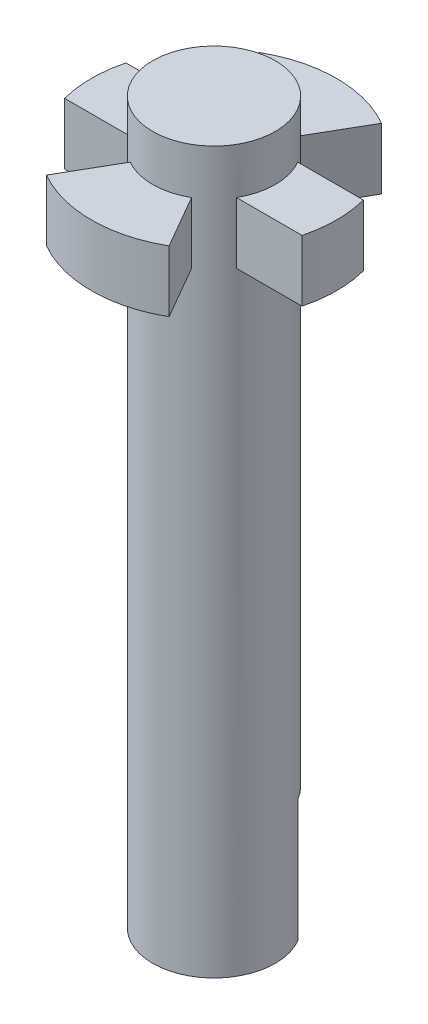
ISO-10303-21;
HEADER;
FILE_DESCRIPTION(('STEP AP214'),'2;1');
FILE_NAME('part.step','',(''),(''),'','','');
FILE_SCHEMA(('AUTOMOTIVE_DESIGN { 1 0 10303 214 1 1 1 1 }'));
ENDSEC;
DATA;
#1=APPLICATION_CONTEXT('core data for automotive mechanical design processes');
#2=APPLICATION_PROTOCOL_DEFINITION('international standard','automotive_design',2000,#1);
#3=PRODUCT_CONTEXT('',#1,'mechanical');
#4=PRODUCT('Part','Part','',(#3));
#5=PRODUCT_RELATED_PRODUCT_CATEGORY('part','',(#4));
#6=PRODUCT_DEFINITION_FORMATION('','',#4);
#7=PRODUCT_DEFINITION_CONTEXT('part definition',#1,'design');
#8=PRODUCT_DEFINITION('design','',#6,#7);
#9=PRODUCT_DEFINITION_SHAPE('','',#8);
#10=(LENGTH_UNIT() NAMED_UNIT(*) SI_UNIT(.MILLI.,.METRE.));
#11=(NAMED_UNIT(*) PLANE_ANGLE_UNIT() SI_UNIT($,.RADIAN.));
#12=(NAMED_UNIT(*) SI_UNIT($,.STERADIAN.) SOLID_ANGLE_UNIT());
#13=UNCERTAINTY_MEASURE_WITH_UNIT(LENGTH_MEASURE(1.E-05),#10,'distance_accuracy_value','');
#14=(GEOMETRIC_REPRESENTATION_CONTEXT(3) GLOBAL_UNCERTAINTY_ASSIGNED_CONTEXT((#13)) GLOBAL_UNIT_ASSIGNED_CONTEXT((#10,
#11,#12)) REPRESENTATION_CONTEXT('',''));
#15=CARTESIAN_POINT('',(0.,0.,0.));
#16=DIRECTION('',(0.,0.,1.));
#17=DIRECTION('',(1.,0.,0.));
#18=AXIS2_PLACEMENT_3D('',#15,#16,#17);
#19=CARTESIAN_POINT('',(0.,47.,0.));
#20=DIRECTION('',(0.,-1.,0.));
#21=DIRECTION('',(0.,0.,-1.));
#22=AXIS2_PLACEMENT_3D('',#19,#20,#21);
#23=CYLINDRICAL_SURFACE('',#22,4.);
#24=DIRECTION('',(0.,-1.,0.));
#25=VECTOR('',#24,1.);
#26=CARTESIAN_POINT('',(-2.,44.,3.46410161513775));
#27=LINE('',#26,#25);
#28=CARTESIAN_POINT('',(-2.,44.,3.46410161513776));
#29=VERTEX_POINT('',#28);
#30=CARTESIAN_POINT('',(-2.,40.,3.46410161513776));
#31=VERTEX_POINT('',#30);
#32=EDGE_CURVE('E185',#29,#31,#27,.T.);
#33=ORIENTED_EDGE('',*,*,#32,.F.);
#34=CARTESIAN_POINT('',(0.,44.,0.));
#35=DIRECTION('',(0.,-1.,0.));
#36=DIRECTION('',(0.,0.,1.));
#37=AXIS2_PLACEMENT_3D('',#34,#35,#36);
#38=CIRCLE('',#37,3.99999999999999);
#39=CARTESIAN_POINT('',(2.,44.,3.46410161513775));
#40=VERTEX_POINT('',#39);
#41=EDGE_CURVE('E61',#40,#29,#38,.T.);
#42=ORIENTED_EDGE('',*,*,#41,.F.);
#43=DIRECTION('',(0.,-1.,0.));
#44=VECTOR('',#43,1.);
#45=CARTESIAN_POINT('',(2.,44.,3.46410161513774));
#46=LINE('',#45,#44);
#47=CARTESIAN_POINT('',(2.,40.,3.46410161513774));
#48=VERTEX_POINT('',#47);
#49=EDGE_CURVE('E183',#40,#48,#46,.T.);
#50=ORIENTED_EDGE('',*,*,#49,.T.);
#51=CARTESIAN_POINT('',(0.,40.,0.));
#52=DIRECTION('',(0.,-1.,0.));
#53=DIRECTION('',(0.,0.,1.));
#54=AXIS2_PLACEMENT_3D('',#51,#52,#53);
#55=CIRCLE('',#54,3.99999999999999);
#56=EDGE_CURVE('E194',#48,#31,#55,.T.);
#57=ORIENTED_EDGE('',*,*,#56,.T.);
#58=EDGE_LOOP('',(#33,#42,#50,#57));
#59=FACE_BOUND('',#58,.T.);
#60=DIRECTION('',(0.,-1.,0.));
#61=VECTOR('',#60,1.);
#62=CARTESIAN_POINT('',(3.46410161513775,44.,1.99999999999999));
#63=LINE('',#62,#61);
#64=CARTESIAN_POINT('',(3.46410161513776,44.,1.99999999999999));
#65=VERTEX_POINT('',#64);
#66=CARTESIAN_POINT('',(3.46410161513776,40.,1.99999999999999));
#67=VERTEX_POINT('',#66);
#68=EDGE_CURVE('E214',#65,#67,#63,.T.);
#69=ORIENTED_EDGE('',*,*,#68,.F.);
#70=CARTESIAN_POINT('',(0.,44.,0.));
#71=DIRECTION('',(0.,-1.,0.));
#72=DIRECTION('',(0.,0.,1.));
#73=AXIS2_PLACEMENT_3D('',#70,#71,#72);
#74=CIRCLE('',#73,3.99999999999999);
#75=CARTESIAN_POINT('',(3.46410161513776,44.,-1.99999999999999));
#76=VERTEX_POINT('',#75);
#77=EDGE_CURVE('E234',#76,#65,#74,.T.);
#78=ORIENTED_EDGE('',*,*,#77,.F.);
#79=DIRECTION('',(0.,-1.,0.));
#80=VECTOR('',#79,1.);
#81=CARTESIAN_POINT('',(3.46410161513775,44.,-1.99999999999999));
#82=LINE('',#81,#80);
#83=CARTESIAN_POINT('',(3.46410161513775,40.,-1.99999999999999));
#84=VERTEX_POINT('',#83);
#85=EDGE_CURVE('E212',#76,#84,#82,.T.);
#86=ORIENTED_EDGE('',*,*,#85,.T.);
#87=CARTESIAN_POINT('',(0.,40.,0.));
#88=DIRECTION('',(0.,-1.,0.));
#89=DIRECTION('',(0.,0.,1.));
#90=AXIS2_PLACEMENT_3D('',#87,#88,#89);
#91=CIRCLE('',#90,3.99999999999999);
#92=EDGE_CURVE('E223',#84,#67,#91,.T.);
#93=ORIENTED_EDGE('',*,*,#92,.T.);
#94=EDGE_LOOP('',(#69,#78,#86,#93));
#95=FACE_BOUND('',#94,.T.);
#96=DIRECTION('',(0.,-1.,0.));
#97=VECTOR('',#96,1.);
#98=CARTESIAN_POINT('',(-3.46410161513775,44.,-2.));
#99=LINE('',#98,#97);
#100=CARTESIAN_POINT('',(-3.46410161513775,44.,-2.));
#101=VERTEX_POINT('',#100);
#102=CARTESIAN_POINT('',(-3.46410161513775,40.,-2.));
#103=VERTEX_POINT('',#102);
#104=EDGE_CURVE('E246',#101,#103,#99,.T.);
#105=ORIENTED_EDGE('',*,*,#104,.F.);
#106=CARTESIAN_POINT('',(0.,44.,0.));
#107=DIRECTION('',(0.,-1.,0.));
#108=DIRECTION('',(0.,0.,1.));
#109=AXIS2_PLACEMENT_3D('',#106,#107,#108);
#110=CIRCLE('',#109,4.);
#111=CARTESIAN_POINT('',(-3.46410161513775,44.,2.));
#112=VERTEX_POINT('',#111);
#113=EDGE_CURVE('E266',#112,#101,#110,.T.);
#114=ORIENTED_EDGE('',*,*,#113,.F.);
#115=DIRECTION('',(0.,-1.,0.));
#116=VECTOR('',#115,1.);
#117=CARTESIAN_POINT('',(-3.46410161513776,44.,2.));
#118=LINE('',#117,#116);
#119=CARTESIAN_POINT('',(-3.46410161513776,40.,2.));
#120=VERTEX_POINT('',#119);
#121=EDGE_CURVE('E244',#112,#120,#118,.T.);
#122=ORIENTED_EDGE('',*,*,#121,.T.);
#123=CARTESIAN_POINT('',(0.,40.,0.));
#124=DIRECTION('',(0.,-1.,0.));
#125=DIRECTION('',(0.,0.,1.));
#126=AXIS2_PLACEMENT_3D('',#123,#124,#125);
#127=CIRCLE('',#126,4.);
#128=EDGE_CURVE('E255',#120,#103,#127,.T.);
#129=ORIENTED_EDGE('',*,*,#128,.T.);
#130=EDGE_LOOP('',(#105,#114,#122,#129));
#131=FACE_BOUND('',#130,.T.);
#132=DIRECTION('',(0.,-1.,0.));
#133=VECTOR('',#132,1.);
#134=CARTESIAN_POINT('',(2.,44.,-3.46410161513775));
#135=LINE('',#134,#133);
#136=CARTESIAN_POINT('',(2.,44.,-3.46410161513775));
#137=VERTEX_POINT('',#136);
#138=CARTESIAN_POINT('',(2.,40.,-3.46410161513775));
#139=VERTEX_POINT('',#138);
#140=EDGE_CURVE('E297',#137,#139,#135,.T.);
#141=ORIENTED_EDGE('',*,*,#140,.F.);
#142=CARTESIAN_POINT('',(0.,44.,0.));
#143=DIRECTION('',(0.,-1.,0.));
#144=DIRECTION('',(0.,0.,1.));
#145=AXIS2_PLACEMENT_3D('',#142,#143,#144);
#146=CIRCLE('',#145,3.99999999999999);
#147=CARTESIAN_POINT('',(-2.,44.,-3.46410161513776));
#148=VERTEX_POINT('',#147);
#149=EDGE_CURVE('E281',#148,#137,#146,.T.);
#150=ORIENTED_EDGE('',*,*,#149,.F.);
#151=DIRECTION('',(0.,-1.,0.));
#152=VECTOR('',#151,1.);
#153=CARTESIAN_POINT('',(-2.,44.,-3.46410161513776));
#154=LINE('',#153,#152);
#155=CARTESIAN_POINT('',(-2.,40.,-3.46410161513776));
#156=VERTEX_POINT('',#155);
#157=EDGE_CURVE('E300',#148,#156,#154,.T.);
#158=ORIENTED_EDGE('',*,*,#157,.T.);
#159=CARTESIAN_POINT('',(0.,40.,0.));
#160=DIRECTION('',(0.,-1.,0.));
#161=DIRECTION('',(0.,0.,1.));
#162=AXIS2_PLACEMENT_3D('',#159,#160,#161);
#163=CIRCLE('',#162,3.99999999999999);
#164=EDGE_CURVE('E292',#156,#139,#163,.T.);
#165=ORIENTED_EDGE('',*,*,#164,.T.);
#166=EDGE_LOOP('',(#141,#150,#158,#165));
#167=FACE_BOUND('',#166,.T.);
#168=CARTESIAN_POINT('',(0.,47.,0.));
#169=DIRECTION('',(0.,1.,0.));
#170=DIRECTION('',(0.,0.,1.));
#171=AXIS2_PLACEMENT_3D('',#168,#169,#170);
#172=CIRCLE('',#171,4.);
#173=CARTESIAN_POINT('',(0.,47.,4.));
#174=VERTEX_POINT('',#173);
#175=EDGE_CURVE('E11',#174,#174,#172,.T.);
#176=ORIENTED_EDGE('',*,*,#175,.F.);
#177=EDGE_LOOP('',(#176));
#178=FACE_BOUND('',#177,.T.);
#179=CARTESIAN_POINT('',(0.,8.,0.));
#180=DIRECTION('',(0.,-1.,0.));
#181=DIRECTION('',(0.,0.,-1.));
#182=AXIS2_PLACEMENT_3D('',#179,#180,#181);
#183=CIRCLE('',#182,4.);
#184=CARTESIAN_POINT('',(-3.46410161513775,8.,-2.));
#185=VERTEX_POINT('',#184);
#186=CARTESIAN_POINT('',(3.46410161513775,8.,-2.));
#187=VERTEX_POINT('',#186);
#188=EDGE_CURVE('E164',#185,#187,#183,.T.);
#189=ORIENTED_EDGE('',*,*,#188,.F.);
#190=DIRECTION('',(0.,-1.,0.));
#191=VECTOR('',#190,1.);
#192=CARTESIAN_POINT('',(-3.46410161513775,8.,-2.));
#193=LINE('',#192,#191);
#194=CARTESIAN_POINT('',(-3.46410161513775,0.,-2.));
#195=VERTEX_POINT('',#194);
#196=EDGE_CURVE('E172',#185,#195,#193,.T.);
#197=ORIENTED_EDGE('',*,*,#196,.T.);
#198=CARTESIAN_POINT('',(0.,0.,0.));
#199=DIRECTION('',(0.,1.,0.));
#200=DIRECTION('',(0.,0.,1.));
#201=AXIS2_PLACEMENT_3D('',#198,#199,#200);
#202=CIRCLE('',#201,4.);
#203=CARTESIAN_POINT('',(3.46410161513775,0.,-2.));
#204=VERTEX_POINT('',#203);
#205=EDGE_CURVE('E42',#195,#204,#202,.T.);
#206=ORIENTED_EDGE('',*,*,#205,.T.);
#207=DIRECTION('',(0.,-1.,0.));
#208=VECTOR('',#207,1.);
#209=CARTESIAN_POINT('',(3.46410161513775,8.,-2.));
#210=LINE('',#209,#208);
#211=EDGE_CURVE('E53',#187,#204,#210,.T.);
#212=ORIENTED_EDGE('',*,*,#211,.F.);
#213=EDGE_LOOP('',(#189,#197,#206,#212));
#214=FACE_BOUND('',#213,.T.);
#215=ADVANCED_FACE('F39',(#59,#95,#131,#167,#178,#214),#23,.T.);
#216=CARTESIAN_POINT('',(0.,47.,0.));
#217=DIRECTION('',(0.,1.,0.));
#218=DIRECTION('',(0.,0.,1.));
#219=AXIS2_PLACEMENT_3D('',#216,#217,#218);
#220=PLANE('',#219);
#221=ORIENTED_EDGE('',*,*,#175,.T.);
#222=EDGE_LOOP('',(#221));
#223=FACE_BOUND('',#222,.T.);
#224=ADVANCED_FACE('F335',(#223),#220,.T.);
#225=CARTESIAN_POINT('',(0.,0.,0.));
#226=DIRECTION('',(0.,1.,0.));
#227=DIRECTION('',(0.,0.,1.));
#228=AXIS2_PLACEMENT_3D('',#225,#226,#227);
#229=PLANE('',#228);
#230=ORIENTED_EDGE('',*,*,#205,.F.);
#231=DIRECTION('',(-1.,0.,0.));
#232=VECTOR('',#231,1.);
#233=CARTESIAN_POINT('',(-3.46410161513775,0.,-2.));
#234=LINE('',#233,#232);
#235=EDGE_CURVE('E169',#204,#195,#234,.T.);
#236=ORIENTED_EDGE('',*,*,#235,.F.);
#237=EDGE_LOOP('',(#230,#236));
#238=FACE_BOUND('',#237,.T.);
#239=ADVANCED_FACE('F341',(#238),#229,.F.);
#240=CARTESIAN_POINT('',(0.,44.,0.));
#241=DIRECTION('',(0.,-1.,0.));
#242=DIRECTION('',(0.,0.,-1.));
#243=AXIS2_PLACEMENT_3D('',#240,#241,#242);
#244=CYLINDRICAL_SURFACE('',#243,7.99999999999999);
#245=CARTESIAN_POINT('',(0.,40.,0.));
#246=DIRECTION('',(0.,1.,0.));
#247=DIRECTION('',(0.,0.,1.));
#248=AXIS2_PLACEMENT_3D('',#245,#246,#247);
#249=CIRCLE('',#248,7.99999999999999);
#250=CARTESIAN_POINT('',(4.,40.,-6.9282032302755));
#251=VERTEX_POINT('',#250);
#252=CARTESIAN_POINT('',(-4.,40.,-6.92820323027551));
#253=VERTEX_POINT('',#252);
#254=EDGE_CURVE('E264',#251,#253,#249,.T.);
#255=ORIENTED_EDGE('',*,*,#254,.T.);
#256=DIRECTION('',(0.,-1.,0.));
#257=VECTOR('',#256,1.);
#258=CARTESIAN_POINT('',(-4.,44.,-6.92820323027551));
#259=LINE('',#258,#257);
#260=CARTESIAN_POINT('',(-4.,44.,-6.92820323027551));
#261=VERTEX_POINT('',#260);
#262=EDGE_CURVE('E302',#261,#253,#259,.T.);
#263=ORIENTED_EDGE('',*,*,#262,.F.);
#264=CARTESIAN_POINT('',(0.,44.,0.));
#265=DIRECTION('',(0.,1.,0.));
#266=DIRECTION('',(0.,0.,1.));
#267=AXIS2_PLACEMENT_3D('',#264,#265,#266);
#268=CIRCLE('',#267,7.99999999999999);
#269=CARTESIAN_POINT('',(4.,44.,-6.9282032302755));
#270=VERTEX_POINT('',#269);
#271=EDGE_CURVE('E274',#270,#261,#268,.T.);
#272=ORIENTED_EDGE('',*,*,#271,.F.);
#273=DIRECTION('',(0.,-1.,0.));
#274=VECTOR('',#273,1.);
#275=CARTESIAN_POINT('',(4.,44.,-6.9282032302755));
#276=LINE('',#275,#274);
#277=EDGE_CURVE('E286',#270,#251,#276,.T.);
#278=ORIENTED_EDGE('',*,*,#277,.T.);
#279=EDGE_LOOP('',(#255,#263,#272,#278));
#280=FACE_BOUND('',#279,.T.);
#281=ADVANCED_FACE('F312',(#280),#244,.T.);
#282=CARTESIAN_POINT('',(-4.,44.,-6.92820323027551));
#283=DIRECTION('',(0.866025403784439,0.,-0.5));
#284=DIRECTION('',(-0.5,0.,-0.866025403784439));
#285=AXIS2_PLACEMENT_3D('',#282,#283,#284);
#286=PLANE('',#285);
#287=DIRECTION('',(0.5,0.,0.866025403784439));
#288=VECTOR('',#287,1.);
#289=CARTESIAN_POINT('',(-4.,40.,-6.92820323027551));
#290=LINE('',#289,#288);
#291=EDGE_CURVE('E289',#253,#156,#290,.T.);
#292=ORIENTED_EDGE('',*,*,#291,.T.);
#293=ORIENTED_EDGE('',*,*,#157,.F.);
#294=DIRECTION('',(0.5,0.,0.866025403784439));
#295=VECTOR('',#294,1.);
#296=CARTESIAN_POINT('',(-4.,44.,-6.92820323027551));
#297=LINE('',#296,#295);
#298=EDGE_CURVE('E277',#261,#148,#297,.T.);
#299=ORIENTED_EDGE('',*,*,#298,.F.);
#300=ORIENTED_EDGE('',*,*,#262,.T.);
#301=EDGE_LOOP('',(#292,#293,#299,#300));
#302=FACE_BOUND('',#301,.T.);
#303=ADVANCED_FACE('F306',(#302),#286,.F.);
#304=CARTESIAN_POINT('',(4.,44.,-6.9282032302755));
#305=DIRECTION('',(-0.866025403784439,0.,-0.5));
#306=DIRECTION('',(-0.5,0.,0.866025403784439));
#307=AXIS2_PLACEMENT_3D('',#304,#305,#306);
#308=PLANE('',#307);
#309=DIRECTION('',(0.5,0.,-0.866025403784439));
#310=VECTOR('',#309,1.);
#311=CARTESIAN_POINT('',(4.,40.,-6.9282032302755));
#312=LINE('',#311,#310);
#313=EDGE_CURVE('E278',#139,#251,#312,.T.);
#314=ORIENTED_EDGE('',*,*,#313,.T.);
#315=ORIENTED_EDGE('',*,*,#277,.F.);
#316=DIRECTION('',(0.5,0.,-0.866025403784439));
#317=VECTOR('',#316,1.);
#318=CARTESIAN_POINT('',(4.,44.,-6.9282032302755));
#319=LINE('',#318,#317);
#320=EDGE_CURVE('E284',#137,#270,#319,.T.);
#321=ORIENTED_EDGE('',*,*,#320,.F.);
#322=ORIENTED_EDGE('',*,*,#140,.T.);
#323=EDGE_LOOP('',(#314,#315,#321,#322));
#324=FACE_BOUND('',#323,.T.);
#325=ADVANCED_FACE('F321',(#324),#308,.F.);
#326=CARTESIAN_POINT('',(0.,44.,0.));
#327=DIRECTION('',(0.,1.,0.));
#328=DIRECTION('',(0.,0.,1.));
#329=AXIS2_PLACEMENT_3D('',#326,#327,#328);
#330=PLANE('',#329);
#331=ORIENTED_EDGE('',*,*,#271,.T.);
#332=ORIENTED_EDGE('',*,*,#298,.T.);
#333=ORIENTED_EDGE('',*,*,#149,.T.);
#334=ORIENTED_EDGE('',*,*,#320,.T.);
#335=EDGE_LOOP('',(#331,#332,#333,#334));
#336=FACE_BOUND('',#335,.T.);
#337=ADVANCED_FACE('F323',(#336),#330,.T.);
#338=CARTESIAN_POINT('',(0.,40.,0.));
#339=DIRECTION('',(0.,1.,0.));
#340=DIRECTION('',(0.,0.,1.));
#341=AXIS2_PLACEMENT_3D('',#338,#339,#340);
#342=PLANE('',#341);
#343=ORIENTED_EDGE('',*,*,#254,.F.);
#344=ORIENTED_EDGE('',*,*,#313,.F.);
#345=ORIENTED_EDGE('',*,*,#164,.F.);
#346=ORIENTED_EDGE('',*,*,#291,.F.);
#347=EDGE_LOOP('',(#343,#344,#345,#346));
#348=FACE_BOUND('',#347,.T.);
#349=ADVANCED_FACE('F316',(#348),#342,.F.);
#350=CARTESIAN_POINT('',(0.,44.,0.));
#351=DIRECTION('',(0.,-1.,0.));
#352=DIRECTION('',(0.,0.,-1.));
#353=AXIS2_PLACEMENT_3D('',#350,#351,#352);
#354=CYLINDRICAL_SURFACE('',#353,8.);
#355=CARTESIAN_POINT('',(0.,40.,0.));
#356=DIRECTION('',(0.,1.,0.));
#357=DIRECTION('',(0.,0.,1.));
#358=AXIS2_PLACEMENT_3D('',#355,#356,#357);
#359=CIRCLE('',#358,8.);
#360=CARTESIAN_POINT('',(-7.74596669241483,40.,-2.));
#361=VERTEX_POINT('',#360);
#362=CARTESIAN_POINT('',(-7.74596669241483,40.,2.));
#363=VERTEX_POINT('',#362);
#364=EDGE_CURVE('E261',#361,#363,#359,.T.);
#365=ORIENTED_EDGE('',*,*,#364,.T.);
#366=DIRECTION('',(0.,-1.,0.));
#367=VECTOR('',#366,1.);
#368=CARTESIAN_POINT('',(-7.74596669241483,44.,2.));
#369=LINE('',#368,#367);
#370=CARTESIAN_POINT('',(-7.74596669241483,44.,2.));
#371=VERTEX_POINT('',#370);
#372=EDGE_CURVE('E232',#371,#363,#369,.T.);
#373=ORIENTED_EDGE('',*,*,#372,.F.);
#374=CARTESIAN_POINT('',(0.,44.,0.));
#375=DIRECTION('',(0.,1.,0.));
#376=DIRECTION('',(0.,0.,1.));
#377=AXIS2_PLACEMENT_3D('',#374,#375,#376);
#378=CIRCLE('',#377,8.);
#379=CARTESIAN_POINT('',(-7.74596669241483,44.,-2.));
#380=VERTEX_POINT('',#379);
#381=EDGE_CURVE('E256',#380,#371,#378,.T.);
#382=ORIENTED_EDGE('',*,*,#381,.F.);
#383=DIRECTION('',(0.,-1.,0.));
#384=VECTOR('',#383,1.);
#385=CARTESIAN_POINT('',(-7.74596669241483,44.,-2.));
#386=LINE('',#385,#384);
#387=EDGE_CURVE('E249',#380,#361,#386,.T.);
#388=ORIENTED_EDGE('',*,*,#387,.T.);
#389=EDGE_LOOP('',(#365,#373,#382,#388));
#390=FACE_BOUND('',#389,.T.);
#391=ADVANCED_FACE('F330',(#390),#354,.T.);
#392=CARTESIAN_POINT('',(-7.74596669241483,44.,2.));
#393=DIRECTION('',(0.,0.,-1.));
#394=DIRECTION('',(-1.,0.,0.));
#395=AXIS2_PLACEMENT_3D('',#392,#393,#394);
#396=PLANE('',#395);
#397=DIRECTION('',(1.,0.,0.));
#398=VECTOR('',#397,1.);
#399=CARTESIAN_POINT('',(-7.74596669241483,40.,2.));
#400=LINE('',#399,#398);
#401=EDGE_CURVE('E258',#363,#120,#400,.T.);
#402=ORIENTED_EDGE('',*,*,#401,.T.);
#403=ORIENTED_EDGE('',*,*,#121,.F.);
#404=DIRECTION('',(1.,0.,0.));
#405=VECTOR('',#404,1.);
#406=CARTESIAN_POINT('',(-7.74596669241483,44.,2.));
#407=LINE('',#406,#405);
#408=EDGE_CURVE('E269',#371,#112,#407,.T.);
#409=ORIENTED_EDGE('',*,*,#408,.F.);
#410=ORIENTED_EDGE('',*,*,#372,.T.);
#411=EDGE_LOOP('',(#402,#403,#409,#410));
#412=FACE_BOUND('',#411,.T.);
#413=ADVANCED_FACE('F360',(#412),#396,.F.);
#414=CARTESIAN_POINT('',(-7.74596669241483,44.,-2.));
#415=DIRECTION('',(0.,0.,1.));
#416=DIRECTION('',(1.,0.,0.));
#417=AXIS2_PLACEMENT_3D('',#414,#415,#416);
#418=PLANE('',#417);
#419=DIRECTION('',(-1.,0.,0.));
#420=VECTOR('',#419,1.);
#421=CARTESIAN_POINT('',(-7.74596669241483,40.,-2.));
#422=LINE('',#421,#420);
#423=EDGE_CURVE('E253',#103,#361,#422,.T.);
#424=ORIENTED_EDGE('',*,*,#423,.T.);
#425=ORIENTED_EDGE('',*,*,#387,.F.);
#426=DIRECTION('',(-1.,0.,0.));
#427=VECTOR('',#426,1.);
#428=CARTESIAN_POINT('',(-7.74596669241483,44.,-2.));
#429=LINE('',#428,#427);
#430=EDGE_CURVE('E252',#101,#380,#429,.T.);
#431=ORIENTED_EDGE('',*,*,#430,.F.);
#432=ORIENTED_EDGE('',*,*,#104,.T.);
#433=EDGE_LOOP('',(#424,#425,#431,#432));
#434=FACE_BOUND('',#433,.T.);
#435=ADVANCED_FACE('F354',(#434),#418,.F.);
#436=CARTESIAN_POINT('',(0.,44.,0.));
#437=DIRECTION('',(0.,1.,0.));
#438=DIRECTION('',(0.,0.,1.));
#439=AXIS2_PLACEMENT_3D('',#436,#437,#438);
#440=PLANE('',#439);
#441=ORIENTED_EDGE('',*,*,#381,.T.);
#442=ORIENTED_EDGE('',*,*,#408,.T.);
#443=ORIENTED_EDGE('',*,*,#113,.T.);
#444=ORIENTED_EDGE('',*,*,#430,.T.);
#445=EDGE_LOOP('',(#441,#442,#443,#444));
#446=FACE_BOUND('',#445,.T.);
#447=ADVANCED_FACE('F351',(#446),#440,.T.);
#448=CARTESIAN_POINT('',(0.,40.,0.));
#449=DIRECTION('',(0.,1.,0.));
#450=DIRECTION('',(0.,0.,1.));
#451=AXIS2_PLACEMENT_3D('',#448,#449,#450);
#452=PLANE('',#451);
#453=ORIENTED_EDGE('',*,*,#364,.F.);
#454=ORIENTED_EDGE('',*,*,#423,.F.);
#455=ORIENTED_EDGE('',*,*,#128,.F.);
#456=ORIENTED_EDGE('',*,*,#401,.F.);
#457=EDGE_LOOP('',(#453,#454,#455,#456));
#458=FACE_BOUND('',#457,.T.);
#459=ADVANCED_FACE('F362',(#458),#452,.F.);
#460=CARTESIAN_POINT('',(0.,44.,0.));
#461=DIRECTION('',(0.,-1.,0.));
#462=DIRECTION('',(0.,0.,-1.));
#463=AXIS2_PLACEMENT_3D('',#460,#461,#462);
#464=CYLINDRICAL_SURFACE('',#463,8.);
#465=CARTESIAN_POINT('',(0.,40.,0.));
#466=DIRECTION('',(0.,1.,0.));
#467=DIRECTION('',(0.,0.,1.));
#468=AXIS2_PLACEMENT_3D('',#465,#466,#467);
#469=CIRCLE('',#468,8.);
#470=CARTESIAN_POINT('',(7.74596669241483,40.,1.99999999999999));
#471=VERTEX_POINT('',#470);
#472=CARTESIAN_POINT('',(7.74596669241483,40.,-1.99999999999999));
#473=VERTEX_POINT('',#472);
#474=EDGE_CURVE('E229',#471,#473,#469,.T.);
#475=ORIENTED_EDGE('',*,*,#474,.T.);
#476=DIRECTION('',(0.,-1.,0.));
#477=VECTOR('',#476,1.);
#478=CARTESIAN_POINT('',(7.74596669241483,44.,-1.99999999999999));
#479=LINE('',#478,#477);
#480=CARTESIAN_POINT('',(7.74596669241483,44.,-1.99999999999999));
#481=VERTEX_POINT('',#480);
#482=EDGE_CURVE('E203',#481,#473,#479,.T.);
#483=ORIENTED_EDGE('',*,*,#482,.F.);
#484=CARTESIAN_POINT('',(0.,44.,0.));
#485=DIRECTION('',(0.,1.,0.));
#486=DIRECTION('',(0.,0.,1.));
#487=AXIS2_PLACEMENT_3D('',#484,#485,#486);
#488=CIRCLE('',#487,8.);
#489=CARTESIAN_POINT('',(7.74596669241483,44.,1.99999999999999));
#490=VERTEX_POINT('',#489);
#491=EDGE_CURVE('E224',#490,#481,#488,.T.);
#492=ORIENTED_EDGE('',*,*,#491,.F.);
#493=DIRECTION('',(0.,-1.,0.));
#494=VECTOR('',#493,1.);
#495=CARTESIAN_POINT('',(7.74596669241483,44.,1.99999999999999));
#496=LINE('',#495,#494);
#497=EDGE_CURVE('E217',#490,#471,#496,.T.);
#498=ORIENTED_EDGE('',*,*,#497,.T.);
#499=EDGE_LOOP('',(#475,#483,#492,#498));
#500=FACE_BOUND('',#499,.T.);
#501=ADVANCED_FACE('F364',(#500),#464,.T.);
#502=CARTESIAN_POINT('',(7.74596669241483,44.,-1.99999999999999));
#503=DIRECTION('',(0.,0.,1.));
#504=DIRECTION('',(1.,0.,0.));
#505=AXIS2_PLACEMENT_3D('',#502,#503,#504);
#506=PLANE('',#505);
#507=DIRECTION('',(-1.,0.,0.));
#508=VECTOR('',#507,1.);
#509=CARTESIAN_POINT('',(7.74596669241483,40.,-1.99999999999999));
#510=LINE('',#509,#508);
#511=EDGE_CURVE('E226',#473,#84,#510,.T.);
#512=ORIENTED_EDGE('',*,*,#511,.T.);
#513=ORIENTED_EDGE('',*,*,#85,.F.);
#514=DIRECTION('',(-1.,0.,0.));
#515=VECTOR('',#514,1.);
#516=CARTESIAN_POINT('',(7.74596669241483,44.,-1.99999999999999));
#517=LINE('',#516,#515);
#518=EDGE_CURVE('E237',#481,#76,#517,.T.);
#519=ORIENTED_EDGE('',*,*,#518,.F.);
#520=ORIENTED_EDGE('',*,*,#482,.T.);
#521=EDGE_LOOP('',(#512,#513,#519,#520));
#522=FACE_BOUND('',#521,.T.);
#523=ADVANCED_FACE('F370',(#522),#506,.F.);
#524=CARTESIAN_POINT('',(7.74596669241483,44.,1.99999999999999));
#525=DIRECTION('',(0.,0.,-1.));
#526=DIRECTION('',(-1.,0.,0.));
#527=AXIS2_PLACEMENT_3D('',#524,#525,#526);
#528=PLANE('',#527);
#529=DIRECTION('',(1.,0.,0.));
#530=VECTOR('',#529,1.);
#531=CARTESIAN_POINT('',(7.74596669241483,40.,1.99999999999999));
#532=LINE('',#531,#530);
#533=EDGE_CURVE('E221',#67,#471,#532,.T.);
#534=ORIENTED_EDGE('',*,*,#533,.T.);
#535=ORIENTED_EDGE('',*,*,#497,.F.);
#536=DIRECTION('',(1.,0.,0.));
#537=VECTOR('',#536,1.);
#538=CARTESIAN_POINT('',(7.74596669241483,44.,1.99999999999999));
#539=LINE('',#538,#537);
#540=EDGE_CURVE('E220',#65,#490,#539,.T.);
#541=ORIENTED_EDGE('',*,*,#540,.F.);
#542=ORIENTED_EDGE('',*,*,#68,.T.);
#543=EDGE_LOOP('',(#534,#535,#541,#542));
#544=FACE_BOUND('',#543,.T.);
#545=ADVANCED_FACE('F384',(#544),#528,.F.);
#546=CARTESIAN_POINT('',(0.,44.,0.));
#547=DIRECTION('',(0.,1.,0.));
#548=DIRECTION('',(0.,0.,1.));
#549=AXIS2_PLACEMENT_3D('',#546,#547,#548);
#550=PLANE('',#549);
#551=ORIENTED_EDGE('',*,*,#491,.T.);
#552=ORIENTED_EDGE('',*,*,#518,.T.);
#553=ORIENTED_EDGE('',*,*,#77,.T.);
#554=ORIENTED_EDGE('',*,*,#540,.T.);
#555=EDGE_LOOP('',(#551,#552,#553,#554));
#556=FACE_BOUND('',#555,.T.);
#557=ADVANCED_FACE('F380',(#556),#550,.T.);
#558=CARTESIAN_POINT('',(0.,40.,0.));
#559=DIRECTION('',(0.,1.,0.));
#560=DIRECTION('',(0.,0.,1.));
#561=AXIS2_PLACEMENT_3D('',#558,#559,#560);
#562=PLANE('',#561);
#563=ORIENTED_EDGE('',*,*,#474,.F.);
#564=ORIENTED_EDGE('',*,*,#533,.F.);
#565=ORIENTED_EDGE('',*,*,#92,.F.);
#566=ORIENTED_EDGE('',*,*,#511,.F.);
#567=EDGE_LOOP('',(#563,#564,#565,#566));
#568=FACE_BOUND('',#567,.T.);
#569=ADVANCED_FACE('F383',(#568),#562,.F.);
#570=CARTESIAN_POINT('',(0.,44.,0.));
#571=DIRECTION('',(0.,-1.,0.));
#572=DIRECTION('',(0.,0.,-1.));
#573=AXIS2_PLACEMENT_3D('',#570,#571,#572);
#574=CYLINDRICAL_SURFACE('',#573,7.99999999999999);
#575=CARTESIAN_POINT('',(0.,40.,0.));
#576=DIRECTION('',(0.,1.,0.));
#577=DIRECTION('',(0.,0.,1.));
#578=AXIS2_PLACEMENT_3D('',#575,#576,#577);
#579=CIRCLE('',#578,7.99999999999999);
#580=CARTESIAN_POINT('',(-4.,40.,6.92820323027551));
#581=VERTEX_POINT('',#580);
#582=CARTESIAN_POINT('',(4.,40.,6.9282032302755));
#583=VERTEX_POINT('',#582);
#584=EDGE_CURVE('E200',#581,#583,#579,.T.);
#585=ORIENTED_EDGE('',*,*,#584,.T.);
#586=DIRECTION('',(0.,-1.,0.));
#587=VECTOR('',#586,1.);
#588=CARTESIAN_POINT('',(4.,44.,6.9282032302755));
#589=LINE('',#588,#587);
#590=CARTESIAN_POINT('',(4.,44.,6.9282032302755));
#591=VERTEX_POINT('',#590);
#592=EDGE_CURVE('E177',#591,#583,#589,.T.);
#593=ORIENTED_EDGE('',*,*,#592,.F.);
#594=CARTESIAN_POINT('',(0.,44.,0.));
#595=DIRECTION('',(0.,1.,0.));
#596=DIRECTION('',(0.,0.,1.));
#597=AXIS2_PLACEMENT_3D('',#594,#595,#596);
#598=CIRCLE('',#597,7.99999999999999);
#599=CARTESIAN_POINT('',(-4.,44.,6.92820323027551));
#600=VERTEX_POINT('',#599);
#601=EDGE_CURVE('E195',#600,#591,#598,.T.);
#602=ORIENTED_EDGE('',*,*,#601,.F.);
#603=DIRECTION('',(0.,-1.,0.));
#604=VECTOR('',#603,1.);
#605=CARTESIAN_POINT('',(-4.,44.,6.92820323027551));
#606=LINE('',#605,#604);
#607=EDGE_CURVE('E188',#600,#581,#606,.T.);
#608=ORIENTED_EDGE('',*,*,#607,.T.);
#609=EDGE_LOOP('',(#585,#593,#602,#608));
#610=FACE_BOUND('',#609,.T.);
#611=ADVANCED_FACE('F388',(#610),#574,.T.);
#612=CARTESIAN_POINT('',(4.,44.,6.9282032302755));
#613=DIRECTION('',(-0.866025403784439,0.,0.5));
#614=DIRECTION('',(0.5,0.,0.866025403784439));
#615=AXIS2_PLACEMENT_3D('',#612,#613,#614);
#616=PLANE('',#615);
#617=DIRECTION('',(-0.5,0.,-0.866025403784439));
#618=VECTOR('',#617,1.);
#619=CARTESIAN_POINT('',(4.,40.,6.9282032302755));
#620=LINE('',#619,#618);
#621=EDGE_CURVE('E197',#583,#48,#620,.T.);
#622=ORIENTED_EDGE('',*,*,#621,.T.);
#623=ORIENTED_EDGE('',*,*,#49,.F.);
#624=DIRECTION('',(-0.5,0.,-0.866025403784439));
#625=VECTOR('',#624,1.);
#626=CARTESIAN_POINT('',(4.,44.,6.9282032302755));
#627=LINE('',#626,#625);
#628=EDGE_CURVE('E206',#591,#40,#627,.T.);
#629=ORIENTED_EDGE('',*,*,#628,.F.);
#630=ORIENTED_EDGE('',*,*,#592,.T.);
#631=EDGE_LOOP('',(#622,#623,#629,#630));
#632=FACE_BOUND('',#631,.T.);
#633=ADVANCED_FACE('F406',(#632),#616,.F.);
#634=CARTESIAN_POINT('',(-4.,44.,6.92820323027551));
#635=DIRECTION('',(0.866025403784439,0.,0.5));
#636=DIRECTION('',(0.5,0.,-0.866025403784439));
#637=AXIS2_PLACEMENT_3D('',#634,#635,#636);
#638=PLANE('',#637);
#639=DIRECTION('',(-0.5,0.,0.866025403784439));
#640=VECTOR('',#639,1.);
#641=CARTESIAN_POINT('',(-4.,40.,6.92820323027551));
#642=LINE('',#641,#640);
#643=EDGE_CURVE('E192',#31,#581,#642,.T.);
#644=ORIENTED_EDGE('',*,*,#643,.T.);
#645=ORIENTED_EDGE('',*,*,#607,.F.);
#646=DIRECTION('',(-0.5,0.,0.866025403784439));
#647=VECTOR('',#646,1.);
#648=CARTESIAN_POINT('',(-4.,44.,6.92820323027551));
#649=LINE('',#648,#647);
#650=EDGE_CURVE('E191',#29,#600,#649,.T.);
#651=ORIENTED_EDGE('',*,*,#650,.F.);
#652=ORIENTED_EDGE('',*,*,#32,.T.);
#653=EDGE_LOOP('',(#644,#645,#651,#652));
#654=FACE_BOUND('',#653,.T.);
#655=ADVANCED_FACE('F400',(#654),#638,.F.);
#656=CARTESIAN_POINT('',(0.,44.,0.));
#657=DIRECTION('',(0.,1.,0.));
#658=DIRECTION('',(0.,0.,1.));
#659=AXIS2_PLACEMENT_3D('',#656,#657,#658);
#660=PLANE('',#659);
#661=ORIENTED_EDGE('',*,*,#601,.T.);
#662=ORIENTED_EDGE('',*,*,#628,.T.);
#663=ORIENTED_EDGE('',*,*,#41,.T.);
#664=ORIENTED_EDGE('',*,*,#650,.T.);
#665=EDGE_LOOP('',(#661,#662,#663,#664));
#666=FACE_BOUND('',#665,.T.);
#667=ADVANCED_FACE('F396',(#666),#660,.T.);
#668=CARTESIAN_POINT('',(0.,40.,0.));
#669=DIRECTION('',(0.,1.,0.));
#670=DIRECTION('',(0.,0.,1.));
#671=AXIS2_PLACEMENT_3D('',#668,#669,#670);
#672=PLANE('',#671);
#673=ORIENTED_EDGE('',*,*,#584,.F.);
#674=ORIENTED_EDGE('',*,*,#643,.F.);
#675=ORIENTED_EDGE('',*,*,#56,.F.);
#676=ORIENTED_EDGE('',*,*,#621,.F.);
#677=EDGE_LOOP('',(#673,#674,#675,#676));
#678=FACE_BOUND('',#677,.T.);
#679=ADVANCED_FACE('F399',(#678),#672,.F.);
#680=CARTESIAN_POINT('',(-3.46410161513775,8.,-2.));
#681=DIRECTION('',(0.,0.,1.));
#682=DIRECTION('',(1.,0.,0.));
#683=AXIS2_PLACEMENT_3D('',#680,#681,#682);
#684=PLANE('',#683);
#685=ORIENTED_EDGE('',*,*,#235,.T.);
#686=ORIENTED_EDGE('',*,*,#196,.F.);
#687=DIRECTION('',(-1.,0.,0.));
#688=VECTOR('',#687,1.);
#689=CARTESIAN_POINT('',(-3.46410161513775,8.,-2.));
#690=LINE('',#689,#688);
#691=EDGE_CURVE('E166',#187,#185,#690,.T.);
#692=ORIENTED_EDGE('',*,*,#691,.F.);
#693=ORIENTED_EDGE('',*,*,#211,.T.);
#694=EDGE_LOOP('',(#685,#686,#692,#693));
#695=FACE_BOUND('',#694,.T.);
#696=ADVANCED_FACE('F171',(#695),#684,.F.);
#697=CARTESIAN_POINT('',(0.,8.,0.));
#698=DIRECTION('',(0.,-1.,0.));
#699=DIRECTION('',(0.,0.,-1.));
#700=AXIS2_PLACEMENT_3D('',#697,#698,#699);
#701=PLANE('',#700);
#702=ORIENTED_EDGE('',*,*,#188,.T.);
#703=ORIENTED_EDGE('',*,*,#691,.T.);
#704=EDGE_LOOP('',(#702,#703));
#705=FACE_BOUND('',#704,.T.);
#706=ADVANCED_FACE('F165',(#705),#701,.T.);
#707=CLOSED_SHELL('',(#215,#224,#239,#281,#303,#325,#337,#349,#391,#413,#435,#447,#459,#501,
#523,#545,#557,#569,#611,#633,#655,#667,#679,#696,#706));
#708=MANIFOLD_SOLID_BREP('B2',#707);
#709=ADVANCED_BREP_SHAPE_REPRESENTATION('',(#18,#708),#14);
#710=SHAPE_DEFINITION_REPRESENTATION(#9,#709);
ENDSEC;
END-ISO-10303-21;
